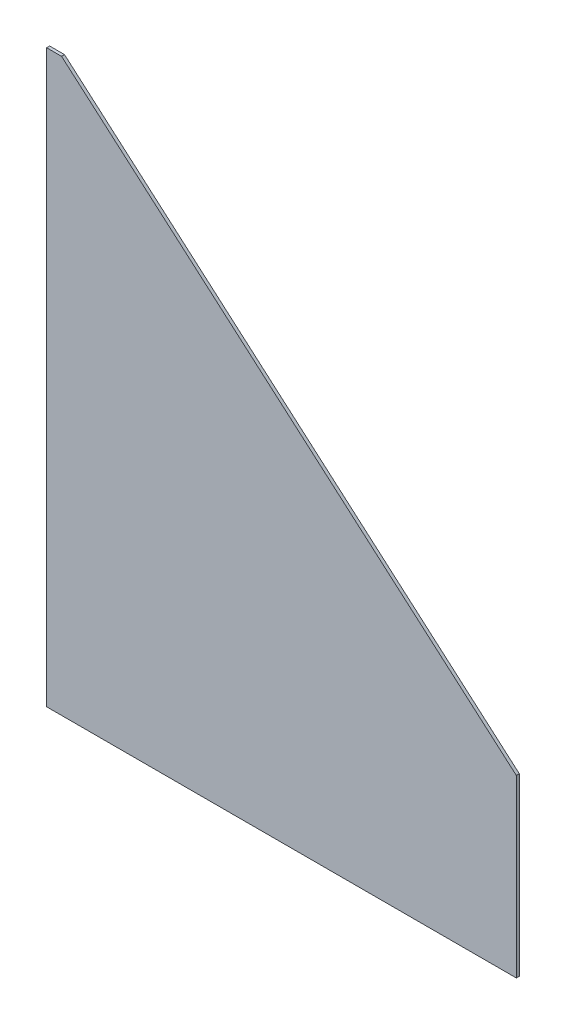
ISO-10303-21;
HEADER;
FILE_DESCRIPTION(('STEP AP214'),'2;1');
FILE_NAME('part.step','',(''),(''),'','','');
FILE_SCHEMA(('AUTOMOTIVE_DESIGN { 1 0 10303 214 1 1 1 1 }'));
ENDSEC;
DATA;
#1=APPLICATION_CONTEXT('core data for automotive mechanical design processes');
#2=APPLICATION_PROTOCOL_DEFINITION('international standard','automotive_design',2000,#1);
#3=PRODUCT_CONTEXT('',#1,'mechanical');
#4=PRODUCT('Part','Part','',(#3));
#5=PRODUCT_RELATED_PRODUCT_CATEGORY('part','',(#4));
#6=PRODUCT_DEFINITION_FORMATION('','',#4);
#7=PRODUCT_DEFINITION_CONTEXT('part definition',#1,'design');
#8=PRODUCT_DEFINITION('design','',#6,#7);
#9=PRODUCT_DEFINITION_SHAPE('','',#8);
#10=(LENGTH_UNIT() NAMED_UNIT(*) SI_UNIT(.MILLI.,.METRE.));
#11=(NAMED_UNIT(*) PLANE_ANGLE_UNIT() SI_UNIT($,.RADIAN.));
#12=(NAMED_UNIT(*) SI_UNIT($,.STERADIAN.) SOLID_ANGLE_UNIT());
#13=UNCERTAINTY_MEASURE_WITH_UNIT(LENGTH_MEASURE(1.E-05),#10,'distance_accuracy_value','');
#14=(GEOMETRIC_REPRESENTATION_CONTEXT(3) GLOBAL_UNCERTAINTY_ASSIGNED_CONTEXT((#13)) GLOBAL_UNIT_ASSIGNED_CONTEXT((#10,
#11,#12)) REPRESENTATION_CONTEXT('',''));
#15=CARTESIAN_POINT('',(0.,0.,0.));
#16=DIRECTION('',(0.,0.,1.));
#17=DIRECTION('',(1.,0.,0.));
#18=AXIS2_PLACEMENT_3D('',#15,#16,#17);
#19=CARTESIAN_POINT('',(0.,0.,-12.7));
#20=DIRECTION('',(1.,0.,0.));
#21=DIRECTION('',(0.,0.,-1.));
#22=AXIS2_PLACEMENT_3D('',#19,#20,#21);
#23=PLANE('',#22);
#24=DIRECTION('',(0.,1.,0.));
#25=VECTOR('',#24,1.);
#26=CARTESIAN_POINT('',(0.,0.,0.));
#27=LINE('',#26,#25);
#28=CARTESIAN_POINT('',(0.,0.,0.));
#29=VERTEX_POINT('',#28);
#30=CARTESIAN_POINT('',(0.,749.3,0.));
#31=VERTEX_POINT('',#30);
#32=EDGE_CURVE('E110',#29,#31,#27,.T.);
#33=ORIENTED_EDGE('',*,*,#32,.F.);
#34=DIRECTION('',(0.,0.,1.));
#35=VECTOR('',#34,1.);
#36=CARTESIAN_POINT('',(0.,0.,-12.7));
#37=LINE('',#36,#35);
#38=CARTESIAN_POINT('',(0.,0.,-12.7));
#39=VERTEX_POINT('',#38);
#40=EDGE_CURVE('E11',#39,#29,#37,.T.);
#41=ORIENTED_EDGE('',*,*,#40,.F.);
#42=DIRECTION('',(0.,1.,0.));
#43=VECTOR('',#42,1.);
#44=CARTESIAN_POINT('',(0.,0.,-12.7));
#45=LINE('',#44,#43);
#46=CARTESIAN_POINT('',(0.,749.3,-12.7));
#47=VERTEX_POINT('',#46);
#48=EDGE_CURVE('E105',#39,#47,#45,.T.);
#49=ORIENTED_EDGE('',*,*,#48,.T.);
#50=DIRECTION('',(0.,0.,1.));
#51=VECTOR('',#50,1.);
#52=CARTESIAN_POINT('',(0.,749.3,-12.7));
#53=LINE('',#52,#51);
#54=EDGE_CURVE('E36',#47,#31,#53,.T.);
#55=ORIENTED_EDGE('',*,*,#54,.T.);
#56=EDGE_LOOP('',(#33,#41,#49,#55));
#57=FACE_BOUND('',#56,.T.);
#58=ADVANCED_FACE('F33',(#57),#23,.T.);
#59=CARTESIAN_POINT('',(0.,0.,-12.7));
#60=DIRECTION('',(0.,-1.,0.));
#61=DIRECTION('',(0.,0.,-1.));
#62=AXIS2_PLACEMENT_3D('',#59,#60,#61);
#63=PLANE('',#62);
#64=DIRECTION('',(1.,0.,0.));
#65=VECTOR('',#64,1.);
#66=CARTESIAN_POINT('',(0.,0.,0.));
#67=LINE('',#66,#65);
#68=CARTESIAN_POINT('',(-2006.6,0.,0.));
#69=VERTEX_POINT('',#68);
#70=EDGE_CURVE('E119',#69,#29,#67,.T.);
#71=ORIENTED_EDGE('',*,*,#70,.F.);
#72=DIRECTION('',(0.,0.,1.));
#73=VECTOR('',#72,1.);
#74=CARTESIAN_POINT('',(-2006.6,0.,-12.7));
#75=LINE('',#74,#73);
#76=CARTESIAN_POINT('',(-2006.6,0.,-12.7));
#77=VERTEX_POINT('',#76);
#78=EDGE_CURVE('E42',#77,#69,#75,.T.);
#79=ORIENTED_EDGE('',*,*,#78,.F.);
#80=DIRECTION('',(1.,0.,0.));
#81=VECTOR('',#80,1.);
#82=CARTESIAN_POINT('',(0.,0.,-12.7));
#83=LINE('',#82,#81);
#84=EDGE_CURVE('E100',#77,#39,#83,.T.);
#85=ORIENTED_EDGE('',*,*,#84,.T.);
#86=ORIENTED_EDGE('',*,*,#40,.T.);
#87=EDGE_LOOP('',(#71,#79,#85,#86));
#88=FACE_BOUND('',#87,.T.);
#89=ADVANCED_FACE('F125',(#88),#63,.T.);
#90=CARTESIAN_POINT('',(-2006.6,0.,-12.7));
#91=DIRECTION('',(-1.,0.,0.));
#92=DIRECTION('',(0.,0.,1.));
#93=AXIS2_PLACEMENT_3D('',#90,#91,#92);
#94=PLANE('',#93);
#95=DIRECTION('',(0.,-1.,0.));
#96=VECTOR('',#95,1.);
#97=CARTESIAN_POINT('',(-2006.6,0.,0.));
#98=LINE('',#97,#96);
#99=CARTESIAN_POINT('',(-2006.6,2438.4,0.));
#100=VERTEX_POINT('',#99);
#101=EDGE_CURVE('E89',#100,#69,#98,.T.);
#102=ORIENTED_EDGE('',*,*,#101,.F.);
#103=DIRECTION('',(0.,0.,1.));
#104=VECTOR('',#103,1.);
#105=CARTESIAN_POINT('',(-2006.6,2438.4,-12.7));
#106=LINE('',#105,#104);
#107=CARTESIAN_POINT('',(-2006.6,2438.4,-12.7));
#108=VERTEX_POINT('',#107);
#109=EDGE_CURVE('E84',#108,#100,#106,.T.);
#110=ORIENTED_EDGE('',*,*,#109,.F.);
#111=DIRECTION('',(0.,-1.,0.));
#112=VECTOR('',#111,1.);
#113=CARTESIAN_POINT('',(-2006.6,0.,-12.7));
#114=LINE('',#113,#112);
#115=EDGE_CURVE('E87',#108,#77,#114,.T.);
#116=ORIENTED_EDGE('',*,*,#115,.T.);
#117=ORIENTED_EDGE('',*,*,#78,.T.);
#118=EDGE_LOOP('',(#102,#110,#116,#117));
#119=FACE_BOUND('',#118,.T.);
#120=ADVANCED_FACE('F86',(#119),#94,.T.);
#121=CARTESIAN_POINT('',(-2006.6,2438.4,-12.7));
#122=DIRECTION('',(0.,1.,0.));
#123=DIRECTION('',(0.,0.,1.));
#124=AXIS2_PLACEMENT_3D('',#121,#122,#123);
#125=PLANE('',#124);
#126=DIRECTION('',(-1.,0.,0.));
#127=VECTOR('',#126,1.);
#128=CARTESIAN_POINT('',(-2006.6,2438.4,0.));
#129=LINE('',#128,#127);
#130=CARTESIAN_POINT('',(-1943.1,2438.4,0.));
#131=VERTEX_POINT('',#130);
#132=EDGE_CURVE('E116',#131,#100,#129,.T.);
#133=ORIENTED_EDGE('',*,*,#132,.F.);
#134=DIRECTION('',(0.,0.,1.));
#135=VECTOR('',#134,1.);
#136=CARTESIAN_POINT('',(-1943.1,2438.4,-12.7));
#137=LINE('',#136,#135);
#138=CARTESIAN_POINT('',(-1943.1,2438.4,-12.7));
#139=VERTEX_POINT('',#138);
#140=EDGE_CURVE('E94',#139,#131,#137,.T.);
#141=ORIENTED_EDGE('',*,*,#140,.F.);
#142=DIRECTION('',(-1.,0.,0.));
#143=VECTOR('',#142,1.);
#144=CARTESIAN_POINT('',(-2006.6,2438.4,-12.7));
#145=LINE('',#144,#143);
#146=EDGE_CURVE('E99',#139,#108,#145,.T.);
#147=ORIENTED_EDGE('',*,*,#146,.T.);
#148=ORIENTED_EDGE('',*,*,#109,.T.);
#149=EDGE_LOOP('',(#133,#141,#147,#148));
#150=FACE_BOUND('',#149,.T.);
#151=ADVANCED_FACE('F102',(#150),#125,.T.);
#152=CARTESIAN_POINT('',(-1943.1,2438.4,-12.7));
#153=DIRECTION('',(0.656056582118545,0.754711707249154,0.));
#154=DIRECTION('',(-0.754711707249154,0.656056582118545,0.));
#155=AXIS2_PLACEMENT_3D('',#152,#153,#154);
#156=PLANE('',#155);
#157=DIRECTION('',(-0.754711707249154,0.656056582118545,0.));
#158=VECTOR('',#157,1.);
#159=CARTESIAN_POINT('',(-1943.1,2438.4,0.));
#160=LINE('',#159,#158);
#161=EDGE_CURVE('E113',#31,#131,#160,.T.);
#162=ORIENTED_EDGE('',*,*,#161,.F.);
#163=ORIENTED_EDGE('',*,*,#54,.F.);
#164=DIRECTION('',(-0.754711707249154,0.656056582118545,0.));
#165=VECTOR('',#164,1.);
#166=CARTESIAN_POINT('',(-1943.1,2438.4,-12.7));
#167=LINE('',#166,#165);
#168=EDGE_CURVE('E103',#47,#139,#167,.T.);
#169=ORIENTED_EDGE('',*,*,#168,.T.);
#170=ORIENTED_EDGE('',*,*,#140,.T.);
#171=EDGE_LOOP('',(#162,#163,#169,#170));
#172=FACE_BOUND('',#171,.T.);
#173=ADVANCED_FACE('F122',(#172),#156,.T.);
#174=CARTESIAN_POINT('',(0.,0.,-12.7));
#175=DIRECTION('',(0.,0.,-1.));
#176=DIRECTION('',(-1.,0.,0.));
#177=AXIS2_PLACEMENT_3D('',#174,#175,#176);
#178=PLANE('',#177);
#179=ORIENTED_EDGE('',*,*,#48,.F.);
#180=ORIENTED_EDGE('',*,*,#84,.F.);
#181=ORIENTED_EDGE('',*,*,#115,.F.);
#182=ORIENTED_EDGE('',*,*,#146,.F.);
#183=ORIENTED_EDGE('',*,*,#168,.F.);
#184=EDGE_LOOP('',(#179,#180,#181,#182,#183));
#185=FACE_BOUND('',#184,.T.);
#186=ADVANCED_FACE('F98',(#185),#178,.T.);
#187=CARTESIAN_POINT('',(0.,0.,0.));
#188=DIRECTION('',(0.,0.,-1.));
#189=DIRECTION('',(-1.,0.,0.));
#190=AXIS2_PLACEMENT_3D('',#187,#188,#189);
#191=PLANE('',#190);
#192=ORIENTED_EDGE('',*,*,#32,.T.);
#193=ORIENTED_EDGE('',*,*,#161,.T.);
#194=ORIENTED_EDGE('',*,*,#132,.T.);
#195=ORIENTED_EDGE('',*,*,#101,.T.);
#196=ORIENTED_EDGE('',*,*,#70,.T.);
#197=EDGE_LOOP('',(#192,#193,#194,#195,#196));
#198=FACE_BOUND('',#197,.T.);
#199=ADVANCED_FACE('F124',(#198),#191,.F.);
#200=CLOSED_SHELL('',(#58,#89,#120,#151,#173,#186,#199));
#201=MANIFOLD_SOLID_BREP('B2',#200);
#202=ADVANCED_BREP_SHAPE_REPRESENTATION('',(#18,#201),#14);
#203=SHAPE_DEFINITION_REPRESENTATION(#9,#202);
ENDSEC;
END-ISO-10303-21;
